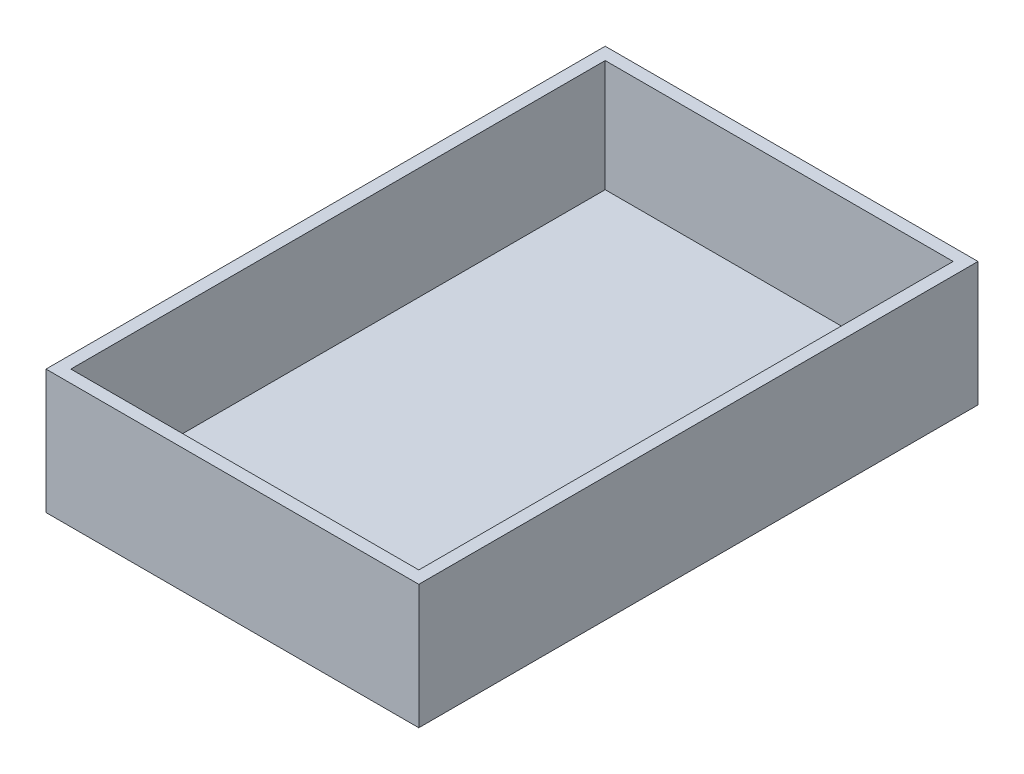
ISO-10303-21;
HEADER;
FILE_DESCRIPTION(('STEP AP214'),'2;1');
FILE_NAME('part.step','',(''),(''),'','','');
FILE_SCHEMA(('AUTOMOTIVE_DESIGN { 1 0 10303 214 1 1 1 1 }'));
ENDSEC;
DATA;
#1=APPLICATION_CONTEXT('core data for automotive mechanical design processes');
#2=APPLICATION_PROTOCOL_DEFINITION('international standard','automotive_design',2000,#1);
#3=PRODUCT_CONTEXT('',#1,'mechanical');
#4=PRODUCT('Part','Part','',(#3));
#5=PRODUCT_RELATED_PRODUCT_CATEGORY('part','',(#4));
#6=PRODUCT_DEFINITION_FORMATION('','',#4);
#7=PRODUCT_DEFINITION_CONTEXT('part definition',#1,'design');
#8=PRODUCT_DEFINITION('design','',#6,#7);
#9=PRODUCT_DEFINITION_SHAPE('','',#8);
#10=(LENGTH_UNIT() NAMED_UNIT(*) SI_UNIT(.MILLI.,.METRE.));
#11=(NAMED_UNIT(*) PLANE_ANGLE_UNIT() SI_UNIT($,.RADIAN.));
#12=(NAMED_UNIT(*) SI_UNIT($,.STERADIAN.) SOLID_ANGLE_UNIT());
#13=UNCERTAINTY_MEASURE_WITH_UNIT(LENGTH_MEASURE(1.E-05),#10,'distance_accuracy_value','');
#14=(GEOMETRIC_REPRESENTATION_CONTEXT(3) GLOBAL_UNCERTAINTY_ASSIGNED_CONTEXT((#13)) GLOBAL_UNIT_ASSIGNED_CONTEXT((#10,
#11,#12)) REPRESENTATION_CONTEXT('',''));
#15=CARTESIAN_POINT('',(0.,0.,0.));
#16=DIRECTION('',(0.,0.,1.));
#17=DIRECTION('',(1.,0.,0.));
#18=AXIS2_PLACEMENT_3D('',#15,#16,#17);
#19=CARTESIAN_POINT('',(0.,0.,-450.));
#20=DIRECTION('',(-1.,0.,0.));
#21=DIRECTION('',(0.,0.,1.));
#22=AXIS2_PLACEMENT_3D('',#19,#20,#21);
#23=PLANE('',#22);
#24=DIRECTION('',(0.,-1.,0.));
#25=VECTOR('',#24,1.);
#26=CARTESIAN_POINT('',(0.,0.,0.));
#27=LINE('',#26,#25);
#28=CARTESIAN_POINT('',(0.,100.,0.));
#29=VERTEX_POINT('',#28);
#30=CARTESIAN_POINT('',(0.,0.,0.));
#31=VERTEX_POINT('',#30);
#32=EDGE_CURVE('E161',#29,#31,#27,.T.);
#33=ORIENTED_EDGE('',*,*,#32,.F.);
#34=DIRECTION('',(0.,0.,1.));
#35=VECTOR('',#34,1.);
#36=CARTESIAN_POINT('',(0.,100.,-450.));
#37=LINE('',#36,#35);
#38=CARTESIAN_POINT('',(0.,100.,-450.));
#39=VERTEX_POINT('',#38);
#40=EDGE_CURVE('E11',#39,#29,#37,.T.);
#41=ORIENTED_EDGE('',*,*,#40,.F.);
#42=DIRECTION('',(0.,-1.,0.));
#43=VECTOR('',#42,1.);
#44=CARTESIAN_POINT('',(0.,0.,-450.));
#45=LINE('',#44,#43);
#46=CARTESIAN_POINT('',(0.,0.,-450.));
#47=VERTEX_POINT('',#46);
#48=EDGE_CURVE('E167',#39,#47,#45,.T.);
#49=ORIENTED_EDGE('',*,*,#48,.T.);
#50=DIRECTION('',(0.,0.,1.));
#51=VECTOR('',#50,1.);
#52=CARTESIAN_POINT('',(0.,0.,-450.));
#53=LINE('',#52,#51);
#54=EDGE_CURVE('E46',#47,#31,#53,.T.);
#55=ORIENTED_EDGE('',*,*,#54,.T.);
#56=EDGE_LOOP('',(#33,#41,#49,#55));
#57=FACE_BOUND('',#56,.T.);
#58=ADVANCED_FACE('F43',(#57),#23,.T.);
#59=CARTESIAN_POINT('',(0.,100.,-450.));
#60=DIRECTION('',(0.,1.,0.));
#61=DIRECTION('',(0.,0.,1.));
#62=AXIS2_PLACEMENT_3D('',#59,#60,#61);
#63=PLANE('',#62);
#64=DIRECTION('',(0.,0.,1.));
#65=VECTOR('',#64,1.);
#66=CARTESIAN_POINT('',(10.,100.,-10.));
#67=LINE('',#66,#65);
#68=CARTESIAN_POINT('',(10.,100.,-440.));
#69=VERTEX_POINT('',#68);
#70=CARTESIAN_POINT('',(10.,100.,-10.));
#71=VERTEX_POINT('',#70);
#72=EDGE_CURVE('E60',#69,#71,#67,.T.);
#73=ORIENTED_EDGE('',*,*,#72,.F.);
#74=DIRECTION('',(-1.,0.,0.));
#75=VECTOR('',#74,1.);
#76=CARTESIAN_POINT('',(10.,100.,-440.));
#77=LINE('',#76,#75);
#78=CARTESIAN_POINT('',(290.,100.,-440.));
#79=VERTEX_POINT('',#78);
#80=EDGE_CURVE('E139',#79,#69,#77,.T.);
#81=ORIENTED_EDGE('',*,*,#80,.F.);
#82=DIRECTION('',(0.,0.,-1.));
#83=VECTOR('',#82,1.);
#84=CARTESIAN_POINT('',(290.,100.,-10.));
#85=LINE('',#84,#83);
#86=CARTESIAN_POINT('',(290.,100.,-10.));
#87=VERTEX_POINT('',#86);
#88=EDGE_CURVE('E143',#87,#79,#85,.T.);
#89=ORIENTED_EDGE('',*,*,#88,.F.);
#90=DIRECTION('',(1.,0.,0.));
#91=VECTOR('',#90,1.);
#92=CARTESIAN_POINT('',(10.,100.,-10.));
#93=LINE('',#92,#91);
#94=EDGE_CURVE('E152',#71,#87,#93,.T.);
#95=ORIENTED_EDGE('',*,*,#94,.F.);
#96=EDGE_LOOP('',(#73,#81,#89,#95));
#97=FACE_BOUND('',#96,.T.);
#98=DIRECTION('',(-1.,0.,0.));
#99=VECTOR('',#98,1.);
#100=CARTESIAN_POINT('',(0.,100.,0.));
#101=LINE('',#100,#99);
#102=CARTESIAN_POINT('',(300.,100.,0.));
#103=VERTEX_POINT('',#102);
#104=EDGE_CURVE('E171',#103,#29,#101,.T.);
#105=ORIENTED_EDGE('',*,*,#104,.F.);
#106=DIRECTION('',(0.,0.,1.));
#107=VECTOR('',#106,1.);
#108=CARTESIAN_POINT('',(300.,100.,-450.));
#109=LINE('',#108,#107);
#110=CARTESIAN_POINT('',(300.,100.,-450.));
#111=VERTEX_POINT('',#110);
#112=EDGE_CURVE('E52',#111,#103,#109,.T.);
#113=ORIENTED_EDGE('',*,*,#112,.F.);
#114=DIRECTION('',(-1.,0.,0.));
#115=VECTOR('',#114,1.);
#116=CARTESIAN_POINT('',(0.,100.,-450.));
#117=LINE('',#116,#115);
#118=EDGE_CURVE('E178',#111,#39,#117,.T.);
#119=ORIENTED_EDGE('',*,*,#118,.T.);
#120=ORIENTED_EDGE('',*,*,#40,.T.);
#121=EDGE_LOOP('',(#105,#113,#119,#120));
#122=FACE_BOUND('',#121,.T.);
#123=ADVANCED_FACE('F203',(#97,#122),#63,.T.);
#124=CARTESIAN_POINT('',(300.,0.,-450.));
#125=DIRECTION('',(1.,0.,0.));
#126=DIRECTION('',(0.,0.,-1.));
#127=AXIS2_PLACEMENT_3D('',#124,#125,#126);
#128=PLANE('',#127);
#129=DIRECTION('',(0.,1.,0.));
#130=VECTOR('',#129,1.);
#131=CARTESIAN_POINT('',(300.,0.,0.));
#132=LINE('',#131,#130);
#133=CARTESIAN_POINT('',(300.,0.,0.));
#134=VERTEX_POINT('',#133);
#135=EDGE_CURVE('E188',#134,#103,#132,.T.);
#136=ORIENTED_EDGE('',*,*,#135,.F.);
#137=DIRECTION('',(0.,0.,1.));
#138=VECTOR('',#137,1.);
#139=CARTESIAN_POINT('',(300.,0.,-450.));
#140=LINE('',#139,#138);
#141=CARTESIAN_POINT('',(300.,0.,-450.));
#142=VERTEX_POINT('',#141);
#143=EDGE_CURVE('E196',#142,#134,#140,.T.);
#144=ORIENTED_EDGE('',*,*,#143,.F.);
#145=DIRECTION('',(0.,1.,0.));
#146=VECTOR('',#145,1.);
#147=CARTESIAN_POINT('',(300.,0.,-450.));
#148=LINE('',#147,#146);
#149=EDGE_CURVE('E174',#142,#111,#148,.T.);
#150=ORIENTED_EDGE('',*,*,#149,.T.);
#151=ORIENTED_EDGE('',*,*,#112,.T.);
#152=EDGE_LOOP('',(#136,#144,#150,#151));
#153=FACE_BOUND('',#152,.T.);
#154=ADVANCED_FACE('F207',(#153),#128,.T.);
#155=CARTESIAN_POINT('',(0.,0.,-450.));
#156=DIRECTION('',(0.,-1.,0.));
#157=DIRECTION('',(0.,0.,-1.));
#158=AXIS2_PLACEMENT_3D('',#155,#156,#157);
#159=PLANE('',#158);
#160=DIRECTION('',(1.,0.,0.));
#161=VECTOR('',#160,1.);
#162=CARTESIAN_POINT('',(0.,0.,0.));
#163=LINE('',#162,#161);
#164=EDGE_CURVE('E184',#31,#134,#163,.T.);
#165=ORIENTED_EDGE('',*,*,#164,.F.);
#166=ORIENTED_EDGE('',*,*,#54,.F.);
#167=DIRECTION('',(1.,0.,0.));
#168=VECTOR('',#167,1.);
#169=CARTESIAN_POINT('',(0.,0.,-450.));
#170=LINE('',#169,#168);
#171=EDGE_CURVE('E170',#47,#142,#170,.T.);
#172=ORIENTED_EDGE('',*,*,#171,.T.);
#173=ORIENTED_EDGE('',*,*,#143,.T.);
#174=EDGE_LOOP('',(#165,#166,#172,#173));
#175=FACE_BOUND('',#174,.T.);
#176=ADVANCED_FACE('F200',(#175),#159,.T.);
#177=CARTESIAN_POINT('',(0.,0.,-450.));
#178=DIRECTION('',(0.,0.,-1.));
#179=DIRECTION('',(-1.,0.,0.));
#180=AXIS2_PLACEMENT_3D('',#177,#178,#179);
#181=PLANE('',#180);
#182=ORIENTED_EDGE('',*,*,#48,.F.);
#183=ORIENTED_EDGE('',*,*,#118,.F.);
#184=ORIENTED_EDGE('',*,*,#149,.F.);
#185=ORIENTED_EDGE('',*,*,#171,.F.);
#186=EDGE_LOOP('',(#182,#183,#184,#185));
#187=FACE_BOUND('',#186,.T.);
#188=ADVANCED_FACE('F209',(#187),#181,.T.);
#189=CARTESIAN_POINT('',(0.,0.,0.));
#190=DIRECTION('',(0.,0.,-1.));
#191=DIRECTION('',(-1.,0.,0.));
#192=AXIS2_PLACEMENT_3D('',#189,#190,#191);
#193=PLANE('',#192);
#194=ORIENTED_EDGE('',*,*,#32,.T.);
#195=ORIENTED_EDGE('',*,*,#164,.T.);
#196=ORIENTED_EDGE('',*,*,#135,.T.);
#197=ORIENTED_EDGE('',*,*,#104,.T.);
#198=EDGE_LOOP('',(#194,#195,#196,#197));
#199=FACE_BOUND('',#198,.T.);
#200=ADVANCED_FACE('F202',(#199),#193,.F.);
#201=CARTESIAN_POINT('',(10.,10.,-10.));
#202=DIRECTION('',(-1.,0.,0.));
#203=DIRECTION('',(0.,0.,1.));
#204=AXIS2_PLACEMENT_3D('',#201,#202,#203);
#205=PLANE('',#204);
#206=ORIENTED_EDGE('',*,*,#72,.T.);
#207=DIRECTION('',(0.,1.,0.));
#208=VECTOR('',#207,1.);
#209=CARTESIAN_POINT('',(10.,10.,-10.));
#210=LINE('',#209,#208);
#211=CARTESIAN_POINT('',(10.,10.,-10.));
#212=VERTEX_POINT('',#211);
#213=EDGE_CURVE('E114',#212,#71,#210,.T.);
#214=ORIENTED_EDGE('',*,*,#213,.F.);
#215=DIRECTION('',(0.,0.,1.));
#216=VECTOR('',#215,1.);
#217=CARTESIAN_POINT('',(10.,10.,-10.));
#218=LINE('',#217,#216);
#219=CARTESIAN_POINT('',(10.,10.,-440.));
#220=VERTEX_POINT('',#219);
#221=EDGE_CURVE('E118',#220,#212,#218,.T.);
#222=ORIENTED_EDGE('',*,*,#221,.F.);
#223=DIRECTION('',(0.,1.,0.));
#224=VECTOR('',#223,1.);
#225=CARTESIAN_POINT('',(10.,10.,-440.));
#226=LINE('',#225,#224);
#227=EDGE_CURVE('E158',#220,#69,#226,.T.);
#228=ORIENTED_EDGE('',*,*,#227,.T.);
#229=EDGE_LOOP('',(#206,#214,#222,#228));
#230=FACE_BOUND('',#229,.T.);
#231=ADVANCED_FACE('F116',(#230),#205,.F.);
#232=CARTESIAN_POINT('',(10.,10.,-440.));
#233=DIRECTION('',(0.,0.,-1.));
#234=DIRECTION('',(-1.,0.,0.));
#235=AXIS2_PLACEMENT_3D('',#232,#233,#234);
#236=PLANE('',#235);
#237=ORIENTED_EDGE('',*,*,#80,.T.);
#238=ORIENTED_EDGE('',*,*,#227,.F.);
#239=DIRECTION('',(-1.,0.,0.));
#240=VECTOR('',#239,1.);
#241=CARTESIAN_POINT('',(10.,10.,-440.));
#242=LINE('',#241,#240);
#243=CARTESIAN_POINT('',(290.,10.,-440.));
#244=VERTEX_POINT('',#243);
#245=EDGE_CURVE('E125',#244,#220,#242,.T.);
#246=ORIENTED_EDGE('',*,*,#245,.F.);
#247=DIRECTION('',(0.,1.,0.));
#248=VECTOR('',#247,1.);
#249=CARTESIAN_POINT('',(290.,10.,-440.));
#250=LINE('',#249,#248);
#251=EDGE_CURVE('E162',#244,#79,#250,.T.);
#252=ORIENTED_EDGE('',*,*,#251,.T.);
#253=EDGE_LOOP('',(#237,#238,#246,#252));
#254=FACE_BOUND('',#253,.T.);
#255=ADVANCED_FACE('F233',(#254),#236,.F.);
#256=CARTESIAN_POINT('',(290.,10.,-10.));
#257=DIRECTION('',(1.,0.,0.));
#258=DIRECTION('',(0.,0.,-1.));
#259=AXIS2_PLACEMENT_3D('',#256,#257,#258);
#260=PLANE('',#259);
#261=ORIENTED_EDGE('',*,*,#88,.T.);
#262=ORIENTED_EDGE('',*,*,#251,.F.);
#263=DIRECTION('',(0.,0.,-1.));
#264=VECTOR('',#263,1.);
#265=CARTESIAN_POINT('',(290.,10.,-10.));
#266=LINE('',#265,#264);
#267=CARTESIAN_POINT('',(290.,10.,-10.));
#268=VERTEX_POINT('',#267);
#269=EDGE_CURVE('E134',#268,#244,#266,.T.);
#270=ORIENTED_EDGE('',*,*,#269,.F.);
#271=DIRECTION('',(0.,1.,0.));
#272=VECTOR('',#271,1.);
#273=CARTESIAN_POINT('',(290.,10.,-10.));
#274=LINE('',#273,#272);
#275=EDGE_CURVE('E124',#268,#87,#274,.T.);
#276=ORIENTED_EDGE('',*,*,#275,.T.);
#277=EDGE_LOOP('',(#261,#262,#270,#276));
#278=FACE_BOUND('',#277,.T.);
#279=ADVANCED_FACE('F231',(#278),#260,.F.);
#280=CARTESIAN_POINT('',(10.,10.,-10.));
#281=DIRECTION('',(0.,0.,1.));
#282=DIRECTION('',(1.,0.,0.));
#283=AXIS2_PLACEMENT_3D('',#280,#281,#282);
#284=PLANE('',#283);
#285=ORIENTED_EDGE('',*,*,#94,.T.);
#286=ORIENTED_EDGE('',*,*,#275,.F.);
#287=DIRECTION('',(1.,0.,0.));
#288=VECTOR('',#287,1.);
#289=CARTESIAN_POINT('',(10.,10.,-10.));
#290=LINE('',#289,#288);
#291=EDGE_CURVE('E128',#212,#268,#290,.T.);
#292=ORIENTED_EDGE('',*,*,#291,.F.);
#293=ORIENTED_EDGE('',*,*,#213,.T.);
#294=EDGE_LOOP('',(#285,#286,#292,#293));
#295=FACE_BOUND('',#294,.T.);
#296=ADVANCED_FACE('F129',(#295),#284,.F.);
#297=CARTESIAN_POINT('',(0.,10.,0.));
#298=DIRECTION('',(0.,-1.,0.));
#299=DIRECTION('',(0.,0.,-1.));
#300=AXIS2_PLACEMENT_3D('',#297,#298,#299);
#301=PLANE('',#300);
#302=ORIENTED_EDGE('',*,*,#221,.T.);
#303=ORIENTED_EDGE('',*,*,#291,.T.);
#304=ORIENTED_EDGE('',*,*,#269,.T.);
#305=ORIENTED_EDGE('',*,*,#245,.T.);
#306=EDGE_LOOP('',(#302,#303,#304,#305));
#307=FACE_BOUND('',#306,.T.);
#308=ADVANCED_FACE('F136',(#307),#301,.F.);
#309=CLOSED_SHELL('',(#58,#123,#154,#176,#188,#200,#231,#255,#279,#296,#308));
#310=MANIFOLD_SOLID_BREP('B2',#309);
#311=ADVANCED_BREP_SHAPE_REPRESENTATION('',(#18,#310),#14);
#312=SHAPE_DEFINITION_REPRESENTATION(#9,#311);
ENDSEC;
END-ISO-10303-21;
